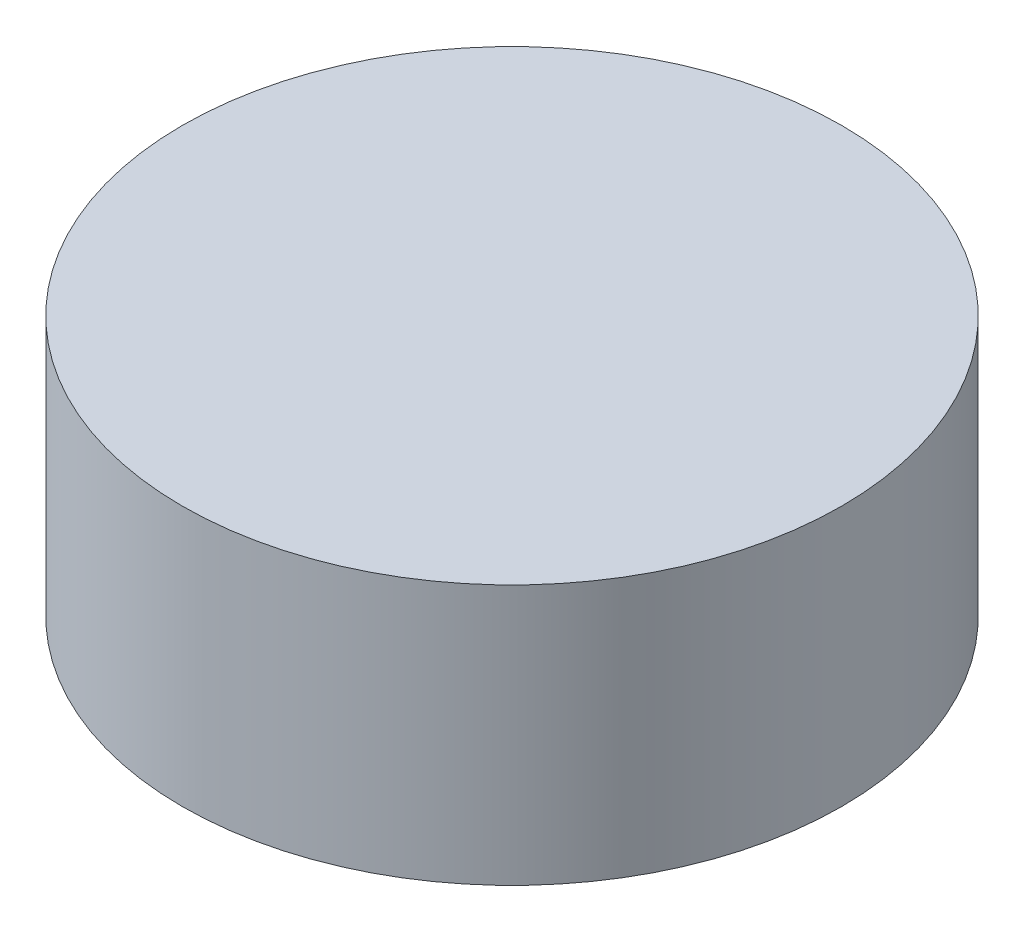
ISO-10303-21;
HEADER;
FILE_DESCRIPTION(('STEP AP214'),'2;1');
FILE_NAME('part.step','',(''),(''),'','','');
FILE_SCHEMA(('AUTOMOTIVE_DESIGN { 1 0 10303 214 1 1 1 1 }'));
ENDSEC;
DATA;
#1=APPLICATION_CONTEXT('core data for automotive mechanical design processes');
#2=APPLICATION_PROTOCOL_DEFINITION('international standard','automotive_design',2000,#1);
#3=PRODUCT_CONTEXT('',#1,'mechanical');
#4=PRODUCT('Part','Part','',(#3));
#5=PRODUCT_RELATED_PRODUCT_CATEGORY('part','',(#4));
#6=PRODUCT_DEFINITION_FORMATION('','',#4);
#7=PRODUCT_DEFINITION_CONTEXT('part definition',#1,'design');
#8=PRODUCT_DEFINITION('design','',#6,#7);
#9=PRODUCT_DEFINITION_SHAPE('','',#8);
#10=(LENGTH_UNIT() NAMED_UNIT(*) SI_UNIT(.MILLI.,.METRE.));
#11=(NAMED_UNIT(*) PLANE_ANGLE_UNIT() SI_UNIT($,.RADIAN.));
#12=(NAMED_UNIT(*) SI_UNIT($,.STERADIAN.) SOLID_ANGLE_UNIT());
#13=UNCERTAINTY_MEASURE_WITH_UNIT(LENGTH_MEASURE(1.E-05),#10,'distance_accuracy_value','');
#14=(GEOMETRIC_REPRESENTATION_CONTEXT(3) GLOBAL_UNCERTAINTY_ASSIGNED_CONTEXT((#13)) GLOBAL_UNIT_ASSIGNED_CONTEXT((#10,
#11,#12)) REPRESENTATION_CONTEXT('',''));
#15=CARTESIAN_POINT('',(0.,0.,0.));
#16=DIRECTION('',(0.,0.,1.));
#17=DIRECTION('',(1.,0.,0.));
#18=AXIS2_PLACEMENT_3D('',#15,#16,#17);
#19=CARTESIAN_POINT('',(0.,30.,0.));
#20=DIRECTION('',(0.,-1.,0.));
#21=DIRECTION('',(0.,0.,-1.));
#22=AXIS2_PLACEMENT_3D('',#19,#20,#21);
#23=CYLINDRICAL_SURFACE('',#22,38.0106782822696);
#24=CARTESIAN_POINT('',(0.,30.,0.));
#25=DIRECTION('',(0.,1.,0.));
#26=DIRECTION('',(0.,0.,1.));
#27=AXIS2_PLACEMENT_3D('',#24,#25,#26);
#28=CIRCLE('',#27,38.0106782822696);
#29=CARTESIAN_POINT('',(0.,30.,38.0106782822696));
#30=VERTEX_POINT('',#29);
#31=EDGE_CURVE('E10',#30,#30,#28,.T.);
#32=ORIENTED_EDGE('',*,*,#31,.F.);
#33=EDGE_LOOP('',(#32));
#34=FACE_BOUND('',#33,.T.);
#35=CARTESIAN_POINT('',(0.,0.,0.));
#36=DIRECTION('',(0.,1.,0.));
#37=DIRECTION('',(0.,0.,1.));
#38=AXIS2_PLACEMENT_3D('',#35,#36,#37);
#39=CIRCLE('',#38,38.0106782822696);
#40=CARTESIAN_POINT('',(0.,0.,38.0106782822696));
#41=VERTEX_POINT('',#40);
#42=EDGE_CURVE('E34',#41,#41,#39,.T.);
#43=ORIENTED_EDGE('',*,*,#42,.T.);
#44=EDGE_LOOP('',(#43));
#45=FACE_BOUND('',#44,.T.);
#46=ADVANCED_FACE('F31',(#34,#45),#23,.T.);
#47=CARTESIAN_POINT('',(0.,30.,0.));
#48=DIRECTION('',(0.,1.,0.));
#49=DIRECTION('',(0.,0.,1.));
#50=AXIS2_PLACEMENT_3D('',#47,#48,#49);
#51=PLANE('',#50);
#52=ORIENTED_EDGE('',*,*,#31,.T.);
#53=EDGE_LOOP('',(#52));
#54=FACE_BOUND('',#53,.T.);
#55=ADVANCED_FACE('F46',(#54),#51,.T.);
#56=CARTESIAN_POINT('',(0.,0.,0.));
#57=DIRECTION('',(0.,1.,0.));
#58=DIRECTION('',(0.,0.,1.));
#59=AXIS2_PLACEMENT_3D('',#56,#57,#58);
#60=PLANE('',#59);
#61=ORIENTED_EDGE('',*,*,#42,.F.);
#62=EDGE_LOOP('',(#61));
#63=FACE_BOUND('',#62,.T.);
#64=ADVANCED_FACE('F44',(#63),#60,.F.);
#65=CLOSED_SHELL('',(#46,#55,#64));
#66=MANIFOLD_SOLID_BREP('B2',#65);
#67=ADVANCED_BREP_SHAPE_REPRESENTATION('',(#18,#66),#14);
#68=SHAPE_DEFINITION_REPRESENTATION(#9,#67);
ENDSEC;
END-ISO-10303-21;
